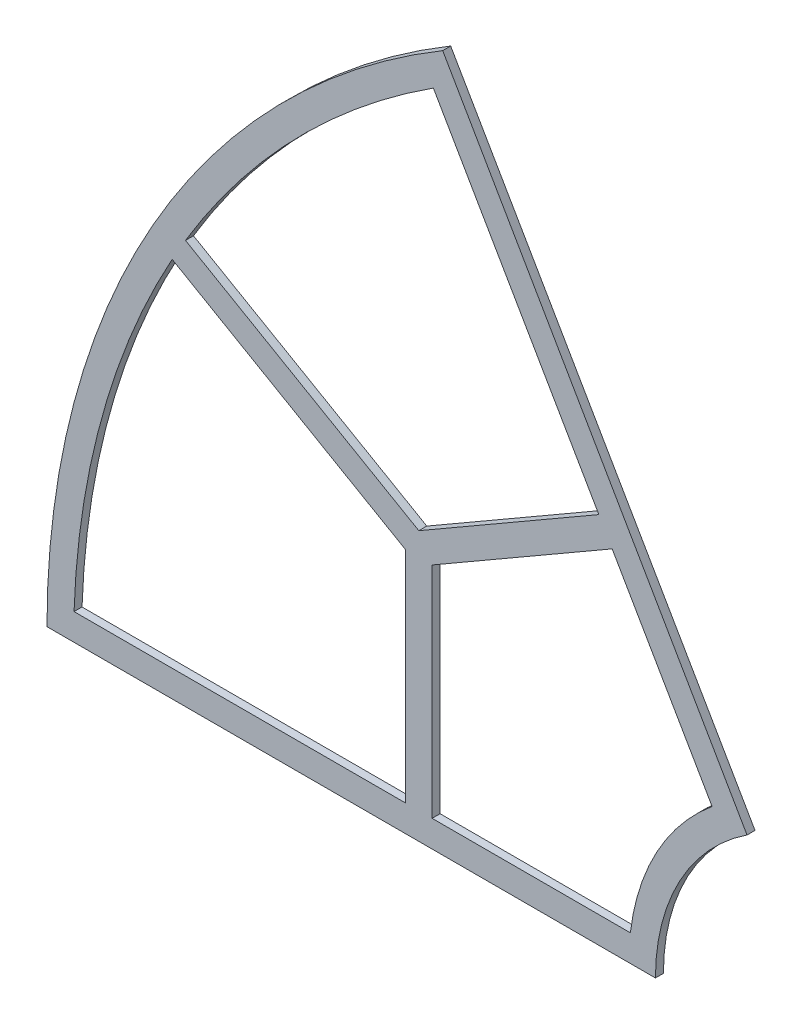
ISO-10303-21;
HEADER;
FILE_DESCRIPTION(('STEP AP214'),'2;1');
FILE_NAME('part.step','',(''),(''),'','','');
FILE_SCHEMA(('AUTOMOTIVE_DESIGN { 1 0 10303 214 1 1 1 1 }'));
ENDSEC;
DATA;
#1=APPLICATION_CONTEXT('core data for automotive mechanical design processes');
#2=APPLICATION_PROTOCOL_DEFINITION('international standard','automotive_design',2000,#1);
#3=PRODUCT_CONTEXT('',#1,'mechanical');
#4=PRODUCT('Part','Part','',(#3));
#5=PRODUCT_RELATED_PRODUCT_CATEGORY('part','',(#4));
#6=PRODUCT_DEFINITION_FORMATION('','',#4);
#7=PRODUCT_DEFINITION_CONTEXT('part definition',#1,'design');
#8=PRODUCT_DEFINITION('design','',#6,#7);
#9=PRODUCT_DEFINITION_SHAPE('','',#8);
#10=(LENGTH_UNIT() NAMED_UNIT(*) SI_UNIT(.MILLI.,.METRE.));
#11=(NAMED_UNIT(*) PLANE_ANGLE_UNIT() SI_UNIT($,.RADIAN.));
#12=(NAMED_UNIT(*) SI_UNIT($,.STERADIAN.) SOLID_ANGLE_UNIT());
#13=UNCERTAINTY_MEASURE_WITH_UNIT(LENGTH_MEASURE(1.E-05),#10,'distance_accuracy_value','');
#14=(GEOMETRIC_REPRESENTATION_CONTEXT(3) GLOBAL_UNCERTAINTY_ASSIGNED_CONTEXT((#13)) GLOBAL_UNIT_ASSIGNED_CONTEXT((#10,
#11,#12)) REPRESENTATION_CONTEXT('',''));
#15=CARTESIAN_POINT('',(0.,0.,0.));
#16=DIRECTION('',(0.,0.,1.));
#17=DIRECTION('',(1.,0.,0.));
#18=AXIS2_PLACEMENT_3D('',#15,#16,#17);
#19=CARTESIAN_POINT('',(5.00000000000019,8.66025403784438,6.));
#20=DIRECTION('',(-0.500000000000014,-0.86602540378443,0.));
#21=DIRECTION('',(0.866025403784431,-0.500000000000014,0.));
#22=AXIS2_PLACEMENT_3D('',#19,#20,#21);
#23=PLANE('',#22);
#24=DIRECTION('',(-0.86602540378443,0.500000000000014,0.));
#25=VECTOR('',#24,1.);
#26=CARTESIAN_POINT('',(5.00000000000019,8.66025403784438,0.));
#27=LINE('',#26,#25);
#28=CARTESIAN_POINT('',(-330.199999999993,202.18806427021,0.));
#29=VERTEX_POINT('',#28);
#30=CARTESIAN_POINT('',(-505.535131014502,303.417849359839,0.));
#31=VERTEX_POINT('',#30);
#32=EDGE_CURVE('E252',#29,#31,#27,.T.);
#33=ORIENTED_EDGE('',*,*,#32,.T.);
#34=DIRECTION('',(0.,0.,-1.));
#35=VECTOR('',#34,1.);
#36=CARTESIAN_POINT('',(-505.535131014502,303.417849359839,6.));
#37=LINE('',#36,#35);
#38=CARTESIAN_POINT('',(-505.535131014502,303.417849359839,6.));
#39=VERTEX_POINT('',#38);
#40=EDGE_CURVE('E11',#39,#31,#37,.T.);
#41=ORIENTED_EDGE('',*,*,#40,.F.);
#42=DIRECTION('',(-0.86602540378443,0.500000000000014,0.));
#43=VECTOR('',#42,1.);
#44=CARTESIAN_POINT('',(5.00000000000019,8.66025403784438,6.));
#45=LINE('',#44,#43);
#46=CARTESIAN_POINT('',(-330.199999999993,202.18806427021,6.));
#47=VERTEX_POINT('',#46);
#48=EDGE_CURVE('E181',#47,#39,#45,.T.);
#49=ORIENTED_EDGE('',*,*,#48,.F.);
#50=DIRECTION('',(0.,0.,-1.));
#51=VECTOR('',#50,1.);
#52=CARTESIAN_POINT('',(-330.199999999993,202.18806427021,6.));
#53=LINE('',#52,#51);
#54=EDGE_CURVE('E67',#47,#29,#53,.T.);
#55=ORIENTED_EDGE('',*,*,#54,.T.);
#56=EDGE_LOOP('',(#33,#41,#49,#55));
#57=FACE_BOUND('',#56,.T.);
#58=ADVANCED_FACE('F47',(#57),#23,.F.);
#59=CARTESIAN_POINT('',(1.11022302462516E-13,0.,6.));
#60=DIRECTION('',(0.,0.,-1.));
#61=DIRECTION('',(-1.,0.,0.));
#62=AXIS2_PLACEMENT_3D('',#59,#60,#61);
#63=CYLINDRICAL_SURFACE('',#62,589.6);
#64=CARTESIAN_POINT('',(1.11022302462516E-13,0.,0.));
#65=DIRECTION('',(0.,0.,1.));
#66=DIRECTION('',(1.,0.,0.));
#67=AXIS2_PLACEMENT_3D('',#64,#65,#66);
#68=CIRCLE('',#67,589.6);
#69=CARTESIAN_POINT('',(-319.272010805122,495.674836073463,0.));
#70=VERTEX_POINT('',#69);
#71=EDGE_CURVE('E188',#31,#70,#68,.F.);
#72=ORIENTED_EDGE('',*,*,#71,.T.);
#73=DIRECTION('',(0.,0.,-1.));
#74=VECTOR('',#73,1.);
#75=CARTESIAN_POINT('',(-319.272010805122,495.674836073463,6.));
#76=LINE('',#75,#74);
#77=CARTESIAN_POINT('',(-319.272010805122,495.674836073463,6.));
#78=VERTEX_POINT('',#77);
#79=EDGE_CURVE('E58',#78,#70,#76,.T.);
#80=ORIENTED_EDGE('',*,*,#79,.F.);
#81=CARTESIAN_POINT('',(1.11022302462516E-13,0.,6.));
#82=DIRECTION('',(0.,0.,1.));
#83=DIRECTION('',(1.,0.,0.));
#84=AXIS2_PLACEMENT_3D('',#81,#82,#83);
#85=CIRCLE('',#84,589.6);
#86=EDGE_CURVE('E175',#39,#78,#85,.F.);
#87=ORIENTED_EDGE('',*,*,#86,.F.);
#88=ORIENTED_EDGE('',*,*,#40,.T.);
#89=EDGE_LOOP('',(#72,#80,#87,#88));
#90=FACE_BOUND('',#89,.T.);
#91=ADVANCED_FACE('F187',(#90),#63,.F.);
#92=CARTESIAN_POINT('',(-24.8205080756886,-14.3301270189221,6.));
#93=DIRECTION('',(-0.866025403784439,-0.5,0.));
#94=DIRECTION('',(0.5,-0.866025403784439,0.));
#95=AXIS2_PLACEMENT_3D('',#92,#93,#94);
#96=PLANE('',#95);
#97=DIRECTION('',(-0.5,0.866025403784439,0.));
#98=VECTOR('',#97,1.);
#99=CARTESIAN_POINT('',(-24.8205080756886,-14.3301270189221,0.));
#100=LINE('',#99,#98);
#101=CARTESIAN_POINT('',(-194.920508075688,280.291715348543,0.));
#102=VERTEX_POINT('',#101);
#103=EDGE_CURVE('E257',#102,#70,#100,.T.);
#104=ORIENTED_EDGE('',*,*,#103,.F.);
#105=DIRECTION('',(0.,0.,-1.));
#106=VECTOR('',#105,1.);
#107=CARTESIAN_POINT('',(-194.920508075688,280.291715348543,6.));
#108=LINE('',#107,#106);
#109=CARTESIAN_POINT('',(-194.920508075688,280.291715348543,6.));
#110=VERTEX_POINT('',#109);
#111=EDGE_CURVE('E120',#110,#102,#108,.T.);
#112=ORIENTED_EDGE('',*,*,#111,.F.);
#113=DIRECTION('',(-0.5,0.866025403784439,0.));
#114=VECTOR('',#113,1.);
#115=CARTESIAN_POINT('',(-24.8205080756886,-14.3301270189221,6.));
#116=LINE('',#115,#114);
#117=EDGE_CURVE('E180',#110,#78,#116,.T.);
#118=ORIENTED_EDGE('',*,*,#117,.T.);
#119=ORIENTED_EDGE('',*,*,#79,.T.);
#120=EDGE_LOOP('',(#104,#112,#118,#119));
#121=FACE_BOUND('',#120,.T.);
#122=ADVANCED_FACE('F193',(#121),#96,.T.);
#123=CARTESIAN_POINT('',(0.,20.,6.));
#124=DIRECTION('',(0.,-1.,0.));
#125=DIRECTION('',(0.,0.,-1.));
#126=AXIS2_PLACEMENT_3D('',#123,#124,#125);
#127=PLANE('',#126);
#128=DIRECTION('',(-1.,0.,0.));
#129=VECTOR('',#128,1.);
#130=CARTESIAN_POINT('',(0.,20.,0.));
#131=LINE('',#130,#129);
#132=CARTESIAN_POINT('',(-340.2,20.,0.));
#133=VERTEX_POINT('',#132);
#134=CARTESIAN_POINT('',(-589.260689338768,20.,0.));
#135=VERTEX_POINT('',#134);
#136=EDGE_CURVE('E236',#133,#135,#131,.T.);
#137=ORIENTED_EDGE('',*,*,#136,.T.);
#138=DIRECTION('',(0.,0.,-1.));
#139=VECTOR('',#138,1.);
#140=CARTESIAN_POINT('',(-589.260689338768,20.,6.));
#141=LINE('',#140,#139);
#142=CARTESIAN_POINT('',(-589.260689338768,20.,6.));
#143=VERTEX_POINT('',#142);
#144=EDGE_CURVE('E267',#143,#135,#141,.T.);
#145=ORIENTED_EDGE('',*,*,#144,.F.);
#146=DIRECTION('',(-1.,0.,0.));
#147=VECTOR('',#146,1.);
#148=CARTESIAN_POINT('',(0.,20.,6.));
#149=LINE('',#148,#147);
#150=CARTESIAN_POINT('',(-340.2,20.,6.));
#151=VERTEX_POINT('',#150);
#152=EDGE_CURVE('E359',#151,#143,#149,.T.);
#153=ORIENTED_EDGE('',*,*,#152,.F.);
#154=DIRECTION('',(0.,0.,-1.));
#155=VECTOR('',#154,1.);
#156=CARTESIAN_POINT('',(-340.2,20.,6.));
#157=LINE('',#156,#155);
#158=EDGE_CURVE('E270',#151,#133,#157,.T.);
#159=ORIENTED_EDGE('',*,*,#158,.T.);
#160=EDGE_LOOP('',(#137,#145,#153,#159));
#161=FACE_BOUND('',#160,.T.);
#162=ADVANCED_FACE('F390',(#161),#127,.F.);
#163=CARTESIAN_POINT('',(1.11022302462516E-13,0.,6.));
#164=DIRECTION('',(0.,0.,-1.));
#165=DIRECTION('',(-1.,0.,0.));
#166=AXIS2_PLACEMENT_3D('',#163,#164,#165);
#167=CYLINDRICAL_SURFACE('',#166,589.6);
#168=CARTESIAN_POINT('',(1.11022302462516E-13,0.,0.));
#169=DIRECTION('',(0.,0.,1.));
#170=DIRECTION('',(1.,0.,0.));
#171=AXIS2_PLACEMENT_3D('',#168,#169,#170);
#172=CIRCLE('',#171,589.6);
#173=CARTESIAN_POINT('',(-515.535131014503,286.097341284151,0.));
#174=VERTEX_POINT('',#173);
#175=EDGE_CURVE('E240',#135,#174,#172,.F.);
#176=ORIENTED_EDGE('',*,*,#175,.T.);
#177=DIRECTION('',(0.,0.,-1.));
#178=VECTOR('',#177,1.);
#179=CARTESIAN_POINT('',(-515.535131014503,286.097341284151,6.));
#180=LINE('',#179,#178);
#181=CARTESIAN_POINT('',(-515.535131014503,286.097341284151,6.));
#182=VERTEX_POINT('',#181);
#183=EDGE_CURVE('E277',#182,#174,#180,.T.);
#184=ORIENTED_EDGE('',*,*,#183,.F.);
#185=CARTESIAN_POINT('',(1.11022302462516E-13,0.,6.));
#186=DIRECTION('',(0.,0.,1.));
#187=DIRECTION('',(1.,0.,0.));
#188=AXIS2_PLACEMENT_3D('',#185,#186,#187);
#189=CIRCLE('',#188,589.6);
#190=EDGE_CURVE('E363',#143,#182,#189,.F.);
#191=ORIENTED_EDGE('',*,*,#190,.F.);
#192=ORIENTED_EDGE('',*,*,#144,.T.);
#193=EDGE_LOOP('',(#176,#184,#191,#192));
#194=FACE_BOUND('',#193,.T.);
#195=ADVANCED_FACE('F392',(#194),#167,.F.);
#196=CARTESIAN_POINT('',(-5.00000000000011,-8.66025403784424,6.));
#197=DIRECTION('',(-0.500000000000014,-0.86602540378443,0.));
#198=DIRECTION('',(0.86602540378443,-0.500000000000014,0.));
#199=AXIS2_PLACEMENT_3D('',#196,#197,#198);
#200=PLANE('',#199);
#201=DIRECTION('',(-0.86602540378443,0.500000000000014,0.));
#202=VECTOR('',#201,1.);
#203=CARTESIAN_POINT('',(-5.00000000000011,-8.66025403784424,0.));
#204=LINE('',#203,#202);
#205=CARTESIAN_POINT('',(-340.199999999999,184.867556194525,0.));
#206=VERTEX_POINT('',#205);
#207=EDGE_CURVE('E244',#206,#174,#204,.T.);
#208=ORIENTED_EDGE('',*,*,#207,.F.);
#209=DIRECTION('',(0.,0.,-1.));
#210=VECTOR('',#209,1.);
#211=CARTESIAN_POINT('',(-340.199999999999,184.867556194525,6.));
#212=LINE('',#211,#210);
#213=CARTESIAN_POINT('',(-340.199999999999,184.867556194525,6.));
#214=VERTEX_POINT('',#213);
#215=EDGE_CURVE('E273',#214,#206,#212,.T.);
#216=ORIENTED_EDGE('',*,*,#215,.F.);
#217=DIRECTION('',(-0.86602540378443,0.500000000000014,0.));
#218=VECTOR('',#217,1.);
#219=CARTESIAN_POINT('',(-5.00000000000011,-8.66025403784424,6.));
#220=LINE('',#219,#218);
#221=EDGE_CURVE('E366',#214,#182,#220,.T.);
#222=ORIENTED_EDGE('',*,*,#221,.T.);
#223=ORIENTED_EDGE('',*,*,#183,.T.);
#224=EDGE_LOOP('',(#208,#216,#222,#223));
#225=FACE_BOUND('',#224,.T.);
#226=ADVANCED_FACE('F385',(#225),#200,.T.);
#227=CARTESIAN_POINT('',(0.,0.,6.));
#228=DIRECTION('',(0.,0.,-1.));
#229=DIRECTION('',(-1.,0.,0.));
#230=AXIS2_PLACEMENT_3D('',#227,#228,#229);
#231=CYLINDRICAL_SURFACE('',#230,152.4);
#232=CARTESIAN_POINT('',(0.,0.,0.));
#233=DIRECTION('',(0.,0.,1.));
#234=DIRECTION('',(1.,0.,0.));
#235=AXIS2_PLACEMENT_3D('',#232,#233,#234);
#236=CIRCLE('',#235,152.4);
#237=CARTESIAN_POINT('',(-83.5768690207475,127.438875405776,0.));
#238=VERTEX_POINT('',#237);
#239=CARTESIAN_POINT('',(-152.4,0.,0.));
#240=VERTEX_POINT('',#239);
#241=EDGE_CURVE('E220',#238,#240,#236,.T.);
#242=ORIENTED_EDGE('',*,*,#241,.F.);
#243=DIRECTION('',(0.,0.,-1.));
#244=VECTOR('',#243,1.);
#245=CARTESIAN_POINT('',(-83.5768690207475,127.438875405776,6.));
#246=LINE('',#245,#244);
#247=CARTESIAN_POINT('',(-83.5768690207475,127.438875405776,6.));
#248=VERTEX_POINT('',#247);
#249=EDGE_CURVE('E274',#248,#238,#246,.T.);
#250=ORIENTED_EDGE('',*,*,#249,.F.);
#251=CARTESIAN_POINT('',(0.,0.,6.));
#252=DIRECTION('',(0.,0.,1.));
#253=DIRECTION('',(1.,0.,0.));
#254=AXIS2_PLACEMENT_3D('',#251,#252,#253);
#255=CIRCLE('',#254,152.4);
#256=CARTESIAN_POINT('',(-152.4,0.,6.));
#257=VERTEX_POINT('',#256);
#258=EDGE_CURVE('E344',#248,#257,#255,.T.);
#259=ORIENTED_EDGE('',*,*,#258,.T.);
#260=DIRECTION('',(0.,0.,-1.));
#261=VECTOR('',#260,1.);
#262=CARTESIAN_POINT('',(-152.4,0.,6.));
#263=LINE('',#262,#261);
#264=EDGE_CURVE('E283',#257,#240,#263,.T.);
#265=ORIENTED_EDGE('',*,*,#264,.T.);
#266=EDGE_LOOP('',(#242,#250,#259,#265));
#267=FACE_BOUND('',#266,.T.);
#268=ADVANCED_FACE('F399',(#267),#231,.F.);
#269=CARTESIAN_POINT('',(-7.5000000000002,-4.33012701892228,6.));
#270=DIRECTION('',(-0.86602540378444,-0.499999999999998,0.));
#271=DIRECTION('',(0.499999999999998,-0.86602540378444,0.));
#272=AXIS2_PLACEMENT_3D('',#269,#270,#271);
#273=PLANE('',#272);
#274=DIRECTION('',(-0.499999999999998,0.86602540378444,0.));
#275=VECTOR('',#274,1.);
#276=CARTESIAN_POINT('',(-7.5000000000002,-4.33012701892228,0.));
#277=LINE('',#276,#275);
#278=CARTESIAN_POINT('',(-312.269240573912,523.545682239279,0.));
#279=VERTEX_POINT('',#278);
#280=EDGE_CURVE('E224',#238,#279,#277,.T.);
#281=ORIENTED_EDGE('',*,*,#280,.T.);
#282=DIRECTION('',(0.,0.,-1.));
#283=VECTOR('',#282,1.);
#284=CARTESIAN_POINT('',(-312.269240573912,523.545682239279,6.));
#285=LINE('',#284,#283);
#286=CARTESIAN_POINT('',(-312.269240573912,523.545682239279,6.));
#287=VERTEX_POINT('',#286);
#288=EDGE_CURVE('E289',#287,#279,#285,.T.);
#289=ORIENTED_EDGE('',*,*,#288,.F.);
#290=DIRECTION('',(-0.499999999999998,0.86602540378444,0.));
#291=VECTOR('',#290,1.);
#292=CARTESIAN_POINT('',(-7.5000000000002,-4.33012701892228,6.));
#293=LINE('',#292,#291);
#294=EDGE_CURVE('E348',#248,#287,#293,.T.);
#295=ORIENTED_EDGE('',*,*,#294,.F.);
#296=ORIENTED_EDGE('',*,*,#249,.T.);
#297=EDGE_LOOP('',(#281,#289,#295,#296));
#298=FACE_BOUND('',#297,.T.);
#299=ADVANCED_FACE('F433',(#298),#273,.F.);
#300=CARTESIAN_POINT('',(1.11022302462516E-13,0.,6.));
#301=DIRECTION('',(0.,0.,-1.));
#302=DIRECTION('',(-1.,0.,0.));
#303=AXIS2_PLACEMENT_3D('',#300,#301,#302);
#304=CYLINDRICAL_SURFACE('',#303,609.6);
#305=CARTESIAN_POINT('',(1.11022302462516E-13,0.,0.));
#306=DIRECTION('',(0.,0.,1.));
#307=DIRECTION('',(1.,0.,0.));
#308=AXIS2_PLACEMENT_3D('',#305,#306,#307);
#309=CIRCLE('',#308,609.6);
#310=CARTESIAN_POINT('',(-609.6,0.,0.));
#311=VERTEX_POINT('',#310);
#312=EDGE_CURVE('E228',#311,#279,#309,.F.);
#313=ORIENTED_EDGE('',*,*,#312,.F.);
#314=DIRECTION('',(0.,0.,-1.));
#315=VECTOR('',#314,1.);
#316=CARTESIAN_POINT('',(-609.6,0.,6.));
#317=LINE('',#316,#315);
#318=CARTESIAN_POINT('',(-609.6,0.,6.));
#319=VERTEX_POINT('',#318);
#320=EDGE_CURVE('E286',#319,#311,#317,.T.);
#321=ORIENTED_EDGE('',*,*,#320,.F.);
#322=CARTESIAN_POINT('',(1.11022302462516E-13,0.,6.));
#323=DIRECTION('',(0.,0.,1.));
#324=DIRECTION('',(1.,0.,0.));
#325=AXIS2_PLACEMENT_3D('',#322,#323,#324);
#326=CIRCLE('',#325,609.6);
#327=EDGE_CURVE('E351',#319,#287,#326,.F.);
#328=ORIENTED_EDGE('',*,*,#327,.T.);
#329=ORIENTED_EDGE('',*,*,#288,.T.);
#330=EDGE_LOOP('',(#313,#321,#328,#329));
#331=FACE_BOUND('',#330,.T.);
#332=ADVANCED_FACE('F429',(#331),#304,.T.);
#333=CARTESIAN_POINT('',(-5.27355936696949E-13,2.77555756156289E-13,6.));
#334=DIRECTION('',(0.,0.,-1.));
#335=DIRECTION('',(-1.,0.,0.));
#336=AXIS2_PLACEMENT_3D('',#333,#334,#335);
#337=CYLINDRICAL_SURFACE('',#336,172.399999999999);
#338=CARTESIAN_POINT('',(-5.27355936696949E-13,2.77555756156289E-13,0.));
#339=DIRECTION('',(0.,0.,1.));
#340=DIRECTION('',(1.,0.,0.));
#341=AXIS2_PLACEMENT_3D('',#338,#339,#340);
#342=CIRCLE('',#341,172.399999999999);
#343=CARTESIAN_POINT('',(-171.235977528088,20.,0.));
#344=VERTEX_POINT('',#343);
#345=CARTESIAN_POINT('',(-109.821022542494,132.895082707078,0.));
#346=VERTEX_POINT('',#345);
#347=EDGE_CURVE('E202',#344,#346,#342,.F.);
#348=ORIENTED_EDGE('',*,*,#347,.F.);
#349=DIRECTION('',(0.,0.,-1.));
#350=VECTOR('',#349,1.);
#351=CARTESIAN_POINT('',(-171.235977528088,20.,6.));
#352=LINE('',#351,#350);
#353=CARTESIAN_POINT('',(-171.235977528088,20.,6.));
#354=VERTEX_POINT('',#353);
#355=EDGE_CURVE('E51',#354,#344,#352,.T.);
#356=ORIENTED_EDGE('',*,*,#355,.F.);
#357=CARTESIAN_POINT('',(-5.27355936696949E-13,2.77555756156289E-13,6.));
#358=DIRECTION('',(0.,0.,1.));
#359=DIRECTION('',(1.,0.,0.));
#360=AXIS2_PLACEMENT_3D('',#357,#358,#359);
#361=CIRCLE('',#360,172.399999999999);
#362=CARTESIAN_POINT('',(-109.821022542494,132.895082707078,6.));
#363=VERTEX_POINT('',#362);
#364=EDGE_CURVE('E264',#354,#363,#361,.F.);
#365=ORIENTED_EDGE('',*,*,#364,.T.);
#366=DIRECTION('',(0.,0.,-1.));
#367=VECTOR('',#366,1.);
#368=CARTESIAN_POINT('',(-109.821022542494,132.895082707078,6.));
#369=LINE('',#368,#367);
#370=EDGE_CURVE('E198',#363,#346,#369,.T.);
#371=ORIENTED_EDGE('',*,*,#370,.T.);
#372=EDGE_LOOP('',(#348,#356,#365,#371));
#373=FACE_BOUND('',#372,.T.);
#374=ADVANCED_FACE('F49',(#373),#337,.T.);
#375=CARTESIAN_POINT('',(0.,20.,6.));
#376=DIRECTION('',(0.,-1.,0.));
#377=DIRECTION('',(1.,0.,0.));
#378=AXIS2_PLACEMENT_3D('',#375,#376,#377);
#379=PLANE('',#378);
#380=DIRECTION('',(-1.,0.,0.));
#381=VECTOR('',#380,1.);
#382=CARTESIAN_POINT('',(0.,20.,0.));
#383=LINE('',#382,#381);
#384=CARTESIAN_POINT('',(-320.2,20.,0.));
#385=VERTEX_POINT('',#384);
#386=EDGE_CURVE('E206',#344,#385,#383,.T.);
#387=ORIENTED_EDGE('',*,*,#386,.T.);
#388=DIRECTION('',(0.,0.,-1.));
#389=VECTOR('',#388,1.);
#390=CARTESIAN_POINT('',(-320.2,20.,6.));
#391=LINE('',#390,#389);
#392=CARTESIAN_POINT('',(-320.2,20.,6.));
#393=VERTEX_POINT('',#392);
#394=EDGE_CURVE('E302',#393,#385,#391,.T.);
#395=ORIENTED_EDGE('',*,*,#394,.F.);
#396=DIRECTION('',(-1.,0.,0.));
#397=VECTOR('',#396,1.);
#398=CARTESIAN_POINT('',(0.,20.,6.));
#399=LINE('',#398,#397);
#400=EDGE_CURVE('E313',#354,#393,#399,.T.);
#401=ORIENTED_EDGE('',*,*,#400,.F.);
#402=ORIENTED_EDGE('',*,*,#355,.T.);
#403=EDGE_LOOP('',(#387,#395,#401,#402));
#404=FACE_BOUND('',#403,.T.);
#405=ADVANCED_FACE('F312',(#404),#379,.F.);
#406=CARTESIAN_POINT('',(-320.2,1.04338286532585E-12,6.));
#407=DIRECTION('',(-1.,0.,0.));
#408=DIRECTION('',(0.,-1.,0.));
#409=AXIS2_PLACEMENT_3D('',#406,#407,#408);
#410=PLANE('',#409);
#411=DIRECTION('',(0.,1.,0.));
#412=VECTOR('',#411,1.);
#413=CARTESIAN_POINT('',(-320.2,1.04338286532585E-12,0.));
#414=LINE('',#413,#412);
#415=CARTESIAN_POINT('',(-320.199999999999,184.867556194525,0.));
#416=VERTEX_POINT('',#415);
#417=EDGE_CURVE('E209',#385,#416,#414,.T.);
#418=ORIENTED_EDGE('',*,*,#417,.T.);
#419=DIRECTION('',(0.,0.,-1.));
#420=VECTOR('',#419,1.);
#421=CARTESIAN_POINT('',(-320.199999999999,184.867556194525,6.));
#422=LINE('',#421,#420);
#423=CARTESIAN_POINT('',(-320.199999999999,184.867556194525,6.));
#424=VERTEX_POINT('',#423);
#425=EDGE_CURVE('E299',#424,#416,#422,.T.);
#426=ORIENTED_EDGE('',*,*,#425,.F.);
#427=DIRECTION('',(0.,1.,0.));
#428=VECTOR('',#427,1.);
#429=CARTESIAN_POINT('',(-320.2,1.04338286532585E-12,6.));
#430=LINE('',#429,#428);
#431=EDGE_CURVE('E332',#393,#424,#430,.T.);
#432=ORIENTED_EDGE('',*,*,#431,.F.);
#433=ORIENTED_EDGE('',*,*,#394,.T.);
#434=EDGE_LOOP('',(#418,#426,#432,#433));
#435=FACE_BOUND('',#434,.T.);
#436=ADVANCED_FACE('F331',(#435),#410,.F.);
#437=CARTESIAN_POINT('',(-160.099999999788,277.301334291782,6.));
#438=DIRECTION('',(-0.499999999999497,0.866025403784729,0.));
#439=DIRECTION('',(-0.866025403784729,-0.499999999999497,0.));
#440=AXIS2_PLACEMENT_3D('',#437,#438,#439);
#441=PLANE('',#440);
#442=DIRECTION('',(0.866025403784729,0.499999999999497,0.));
#443=VECTOR('',#442,1.);
#444=CARTESIAN_POINT('',(-160.099999999788,277.301334291782,0.));
#445=LINE('',#444,#443);
#446=CARTESIAN_POINT('',(-184.920508075688,262.971207272854,0.));
#447=VERTEX_POINT('',#446);
#448=EDGE_CURVE('E212',#416,#447,#445,.T.);
#449=ORIENTED_EDGE('',*,*,#448,.T.);
#450=DIRECTION('',(0.,0.,-1.));
#451=VECTOR('',#450,1.);
#452=CARTESIAN_POINT('',(-184.920508075688,262.971207272854,6.));
#453=LINE('',#452,#451);
#454=CARTESIAN_POINT('',(-184.920508075688,262.971207272854,6.));
#455=VERTEX_POINT('',#454);
#456=EDGE_CURVE('E296',#455,#447,#453,.T.);
#457=ORIENTED_EDGE('',*,*,#456,.F.);
#458=DIRECTION('',(0.866025403784729,0.499999999999497,0.));
#459=VECTOR('',#458,1.);
#460=CARTESIAN_POINT('',(-160.099999999788,277.301334291782,6.));
#461=LINE('',#460,#459);
#462=EDGE_CURVE('E330',#424,#455,#461,.T.);
#463=ORIENTED_EDGE('',*,*,#462,.F.);
#464=ORIENTED_EDGE('',*,*,#425,.T.);
#465=EDGE_LOOP('',(#449,#457,#463,#464));
#466=FACE_BOUND('',#465,.T.);
#467=ADVANCED_FACE('F327',(#466),#441,.F.);
#468=CARTESIAN_POINT('',(-340.2,1.14545845676222E-12,6.));
#469=DIRECTION('',(-1.,0.,0.));
#470=DIRECTION('',(0.,-1.,0.));
#471=AXIS2_PLACEMENT_3D('',#468,#469,#470);
#472=PLANE('',#471);
#473=DIRECTION('',(0.,1.,0.));
#474=VECTOR('',#473,1.);
#475=CARTESIAN_POINT('',(-340.2,1.14545845676222E-12,0.));
#476=LINE('',#475,#474);
#477=EDGE_CURVE('E248',#133,#206,#476,.T.);
#478=ORIENTED_EDGE('',*,*,#477,.F.);
#479=ORIENTED_EDGE('',*,*,#158,.F.);
#480=DIRECTION('',(0.,1.,0.));
#481=VECTOR('',#480,1.);
#482=CARTESIAN_POINT('',(-340.2,1.14545845676222E-12,6.));
#483=LINE('',#482,#481);
#484=EDGE_CURVE('E370',#151,#214,#483,.T.);
#485=ORIENTED_EDGE('',*,*,#484,.T.);
#486=ORIENTED_EDGE('',*,*,#215,.T.);
#487=EDGE_LOOP('',(#478,#479,#485,#486));
#488=FACE_BOUND('',#487,.T.);
#489=ADVANCED_FACE('F377',(#488),#472,.T.);
#490=CARTESIAN_POINT('',(0.,0.,6.));
#491=DIRECTION('',(0.,-1.,0.));
#492=DIRECTION('',(1.,0.,0.));
#493=AXIS2_PLACEMENT_3D('',#490,#491,#492);
#494=PLANE('',#493);
#495=DIRECTION('',(-1.,0.,0.));
#496=VECTOR('',#495,1.);
#497=CARTESIAN_POINT('',(0.,0.,0.));
#498=LINE('',#497,#496);
#499=EDGE_CURVE('E232',#240,#311,#498,.T.);
#500=ORIENTED_EDGE('',*,*,#499,.F.);
#501=ORIENTED_EDGE('',*,*,#264,.F.);
#502=DIRECTION('',(-1.,0.,0.));
#503=VECTOR('',#502,1.);
#504=CARTESIAN_POINT('',(0.,0.,6.));
#505=LINE('',#504,#503);
#506=EDGE_CURVE('E355',#257,#319,#505,.T.);
#507=ORIENTED_EDGE('',*,*,#506,.T.);
#508=ORIENTED_EDGE('',*,*,#320,.T.);
#509=EDGE_LOOP('',(#500,#501,#507,#508));
#510=FACE_BOUND('',#509,.T.);
#511=ADVANCED_FACE('F411',(#510),#494,.T.);
#512=CARTESIAN_POINT('',(-24.8205080756886,-14.3301270189221,6.));
#513=DIRECTION('',(-0.866025403784438,-0.5,0.));
#514=DIRECTION('',(0.5,-0.866025403784439,0.));
#515=AXIS2_PLACEMENT_3D('',#512,#513,#514);
#516=PLANE('',#515);
#517=DIRECTION('',(-0.5,0.866025403784439,0.));
#518=VECTOR('',#517,1.);
#519=CARTESIAN_POINT('',(-24.8205080756886,-14.3301270189221,0.));
#520=LINE('',#519,#518);
#521=EDGE_CURVE('E216',#346,#447,#520,.T.);
#522=ORIENTED_EDGE('',*,*,#521,.F.);
#523=ORIENTED_EDGE('',*,*,#370,.F.);
#524=DIRECTION('',(-0.5,0.866025403784439,0.));
#525=VECTOR('',#524,1.);
#526=CARTESIAN_POINT('',(-24.8205080756886,-14.3301270189221,6.));
#527=LINE('',#526,#525);
#528=EDGE_CURVE('E324',#363,#455,#527,.T.);
#529=ORIENTED_EDGE('',*,*,#528,.T.);
#530=ORIENTED_EDGE('',*,*,#456,.T.);
#531=EDGE_LOOP('',(#522,#523,#529,#530));
#532=FACE_BOUND('',#531,.T.);
#533=ADVANCED_FACE('F323',(#532),#516,.T.);
#534=CARTESIAN_POINT('',(-170.099999999998,294.621842367465,6.));
#535=DIRECTION('',(-0.499999999999997,0.86602540378444,0.));
#536=DIRECTION('',(-0.86602540378444,-0.499999999999998,0.));
#537=AXIS2_PLACEMENT_3D('',#534,#535,#536);
#538=PLANE('',#537);
#539=DIRECTION('',(0.86602540378444,0.499999999999997,0.));
#540=VECTOR('',#539,1.);
#541=CARTESIAN_POINT('',(-170.099999999998,294.621842367465,0.));
#542=LINE('',#541,#540);
#543=EDGE_CURVE('E260',#29,#102,#542,.T.);
#544=ORIENTED_EDGE('',*,*,#543,.F.);
#545=ORIENTED_EDGE('',*,*,#54,.F.);
#546=DIRECTION('',(0.86602540378444,0.499999999999997,0.));
#547=VECTOR('',#546,1.);
#548=CARTESIAN_POINT('',(-170.099999999998,294.621842367465,6.));
#549=LINE('',#548,#547);
#550=EDGE_CURVE('E195',#47,#110,#549,.T.);
#551=ORIENTED_EDGE('',*,*,#550,.T.);
#552=ORIENTED_EDGE('',*,*,#111,.T.);
#553=EDGE_LOOP('',(#544,#545,#551,#552));
#554=FACE_BOUND('',#553,.T.);
#555=ADVANCED_FACE('F456',(#554),#538,.T.);
#556=CARTESIAN_POINT('',(0.,0.,6.));
#557=DIRECTION('',(0.,0.,1.));
#558=DIRECTION('',(1.,0.,0.));
#559=AXIS2_PLACEMENT_3D('',#556,#557,#558);
#560=PLANE('',#559);
#561=ORIENTED_EDGE('',*,*,#364,.F.);
#562=ORIENTED_EDGE('',*,*,#400,.T.);
#563=ORIENTED_EDGE('',*,*,#431,.T.);
#564=ORIENTED_EDGE('',*,*,#462,.T.);
#565=ORIENTED_EDGE('',*,*,#528,.F.);
#566=EDGE_LOOP('',(#561,#562,#563,#564,#565));
#567=FACE_BOUND('',#566,.T.);
#568=ORIENTED_EDGE('',*,*,#258,.F.);
#569=ORIENTED_EDGE('',*,*,#294,.T.);
#570=ORIENTED_EDGE('',*,*,#327,.F.);
#571=ORIENTED_EDGE('',*,*,#506,.F.);
#572=EDGE_LOOP('',(#568,#569,#570,#571));
#573=FACE_BOUND('',#572,.T.);
#574=ORIENTED_EDGE('',*,*,#152,.T.);
#575=ORIENTED_EDGE('',*,*,#190,.T.);
#576=ORIENTED_EDGE('',*,*,#221,.F.);
#577=ORIENTED_EDGE('',*,*,#484,.F.);
#578=EDGE_LOOP('',(#574,#575,#576,#577));
#579=FACE_BOUND('',#578,.T.);
#580=ORIENTED_EDGE('',*,*,#48,.T.);
#581=ORIENTED_EDGE('',*,*,#86,.T.);
#582=ORIENTED_EDGE('',*,*,#117,.F.);
#583=ORIENTED_EDGE('',*,*,#550,.F.);
#584=EDGE_LOOP('',(#580,#581,#582,#583));
#585=FACE_BOUND('',#584,.T.);
#586=ADVANCED_FACE('F177',(#567,#573,#579,#585),#560,.T.);
#587=CARTESIAN_POINT('',(0.,0.,0.));
#588=DIRECTION('',(0.,0.,1.));
#589=DIRECTION('',(1.,0.,0.));
#590=AXIS2_PLACEMENT_3D('',#587,#588,#589);
#591=PLANE('',#590);
#592=ORIENTED_EDGE('',*,*,#347,.T.);
#593=ORIENTED_EDGE('',*,*,#521,.T.);
#594=ORIENTED_EDGE('',*,*,#448,.F.);
#595=ORIENTED_EDGE('',*,*,#417,.F.);
#596=ORIENTED_EDGE('',*,*,#386,.F.);
#597=EDGE_LOOP('',(#592,#593,#594,#595,#596));
#598=FACE_BOUND('',#597,.T.);
#599=ORIENTED_EDGE('',*,*,#241,.T.);
#600=ORIENTED_EDGE('',*,*,#499,.T.);
#601=ORIENTED_EDGE('',*,*,#312,.T.);
#602=ORIENTED_EDGE('',*,*,#280,.F.);
#603=EDGE_LOOP('',(#599,#600,#601,#602));
#604=FACE_BOUND('',#603,.T.);
#605=ORIENTED_EDGE('',*,*,#136,.F.);
#606=ORIENTED_EDGE('',*,*,#477,.T.);
#607=ORIENTED_EDGE('',*,*,#207,.T.);
#608=ORIENTED_EDGE('',*,*,#175,.F.);
#609=EDGE_LOOP('',(#605,#606,#607,#608));
#610=FACE_BOUND('',#609,.T.);
#611=ORIENTED_EDGE('',*,*,#32,.F.);
#612=ORIENTED_EDGE('',*,*,#543,.T.);
#613=ORIENTED_EDGE('',*,*,#103,.T.);
#614=ORIENTED_EDGE('',*,*,#71,.F.);
#615=EDGE_LOOP('',(#611,#612,#613,#614));
#616=FACE_BOUND('',#615,.T.);
#617=ADVANCED_FACE('F316',(#598,#604,#610,#616),#591,.F.);
#618=CLOSED_SHELL('',(#58,#91,#122,#162,#195,#226,#268,#299,#332,#374,#405,#436,#467,#489,#511,
#533,#555,#586,#617));
#619=MANIFOLD_SOLID_BREP('B2',#618);
#620=ADVANCED_BREP_SHAPE_REPRESENTATION('',(#18,#619),#14);
#621=SHAPE_DEFINITION_REPRESENTATION(#9,#620);
ENDSEC;
END-ISO-10303-21;
